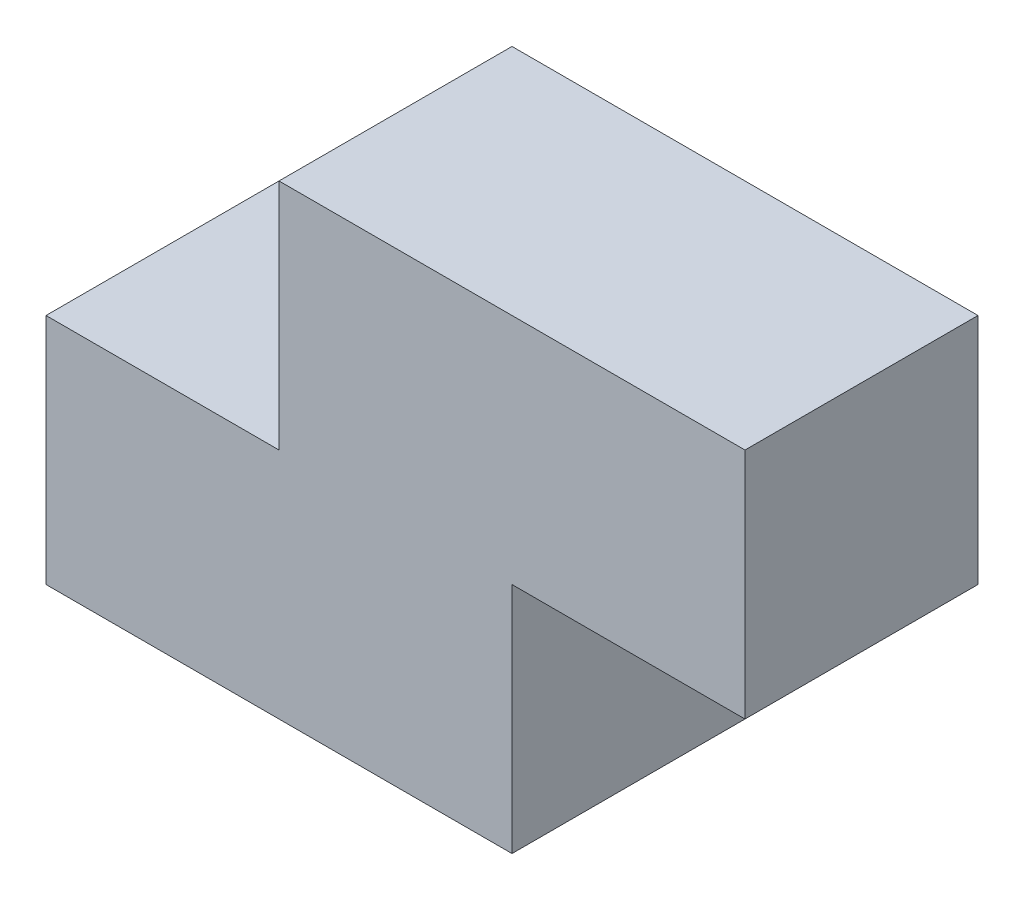
ISO-10303-21;
HEADER;
FILE_DESCRIPTION(('STEP AP214'),'2;1');
FILE_NAME('part.step','',(''),(''),'','','');
FILE_SCHEMA(('AUTOMOTIVE_DESIGN { 1 0 10303 214 1 1 1 1 }'));
ENDSEC;
DATA;
#1=APPLICATION_CONTEXT('core data for automotive mechanical design processes');
#2=APPLICATION_PROTOCOL_DEFINITION('international standard','automotive_design',2000,#1);
#3=PRODUCT_CONTEXT('',#1,'mechanical');
#4=PRODUCT('Part','Part','',(#3));
#5=PRODUCT_RELATED_PRODUCT_CATEGORY('part','',(#4));
#6=PRODUCT_DEFINITION_FORMATION('','',#4);
#7=PRODUCT_DEFINITION_CONTEXT('part definition',#1,'design');
#8=PRODUCT_DEFINITION('design','',#6,#7);
#9=PRODUCT_DEFINITION_SHAPE('','',#8);
#10=(LENGTH_UNIT() NAMED_UNIT(*) SI_UNIT(.MILLI.,.METRE.));
#11=(NAMED_UNIT(*) PLANE_ANGLE_UNIT() SI_UNIT($,.RADIAN.));
#12=(NAMED_UNIT(*) SI_UNIT($,.STERADIAN.) SOLID_ANGLE_UNIT());
#13=UNCERTAINTY_MEASURE_WITH_UNIT(LENGTH_MEASURE(1.E-05),#10,'distance_accuracy_value','');
#14=(GEOMETRIC_REPRESENTATION_CONTEXT(3) GLOBAL_UNCERTAINTY_ASSIGNED_CONTEXT((#13)) GLOBAL_UNIT_ASSIGNED_CONTEXT((#10,
#11,#12)) REPRESENTATION_CONTEXT('',''));
#15=CARTESIAN_POINT('',(0.,0.,0.));
#16=DIRECTION('',(0.,0.,1.));
#17=DIRECTION('',(1.,0.,0.));
#18=AXIS2_PLACEMENT_3D('',#15,#16,#17);
#19=CARTESIAN_POINT('',(0.,30.,-15.));
#20=DIRECTION('',(-1.,0.,0.));
#21=DIRECTION('',(0.,0.,1.));
#22=AXIS2_PLACEMENT_3D('',#19,#20,#21);
#23=PLANE('',#22);
#24=DIRECTION('',(0.,0.,1.));
#25=VECTOR('',#24,1.);
#26=CARTESIAN_POINT('',(0.,0.,-15.));
#27=LINE('',#26,#25);
#28=CARTESIAN_POINT('',(0.,0.,-15.));
#29=VERTEX_POINT('',#28);
#30=CARTESIAN_POINT('',(0.,0.,15.));
#31=VERTEX_POINT('',#30);
#32=EDGE_CURVE('E36',#29,#31,#27,.T.);
#33=ORIENTED_EDGE('',*,*,#32,.T.);
#34=DIRECTION('',(0.,-1.,0.));
#35=VECTOR('',#34,1.);
#36=CARTESIAN_POINT('',(0.,30.,15.));
#37=LINE('',#36,#35);
#38=CARTESIAN_POINT('',(0.,30.,15.));
#39=VERTEX_POINT('',#38);
#40=EDGE_CURVE('E97',#39,#31,#37,.T.);
#41=ORIENTED_EDGE('',*,*,#40,.F.);
#42=DIRECTION('',(0.,0.,1.));
#43=VECTOR('',#42,1.);
#44=CARTESIAN_POINT('',(0.,30.,-15.));
#45=LINE('',#44,#43);
#46=CARTESIAN_POINT('',(0.,30.,-15.));
#47=VERTEX_POINT('',#46);
#48=EDGE_CURVE('E11',#47,#39,#45,.T.);
#49=ORIENTED_EDGE('',*,*,#48,.F.);
#50=DIRECTION('',(0.,-1.,0.));
#51=VECTOR('',#50,1.);
#52=CARTESIAN_POINT('',(0.,30.,-15.));
#53=LINE('',#52,#51);
#54=EDGE_CURVE('E98',#47,#29,#53,.T.);
#55=ORIENTED_EDGE('',*,*,#54,.T.);
#56=EDGE_LOOP('',(#33,#41,#49,#55));
#57=FACE_BOUND('',#56,.T.);
#58=ADVANCED_FACE('F33',(#57),#23,.T.);
#59=CARTESIAN_POINT('',(30.,30.,-15.));
#60=DIRECTION('',(0.,1.,0.));
#61=DIRECTION('',(0.,0.,1.));
#62=AXIS2_PLACEMENT_3D('',#59,#60,#61);
#63=PLANE('',#62);
#64=ORIENTED_EDGE('',*,*,#48,.T.);
#65=DIRECTION('',(-1.,0.,0.));
#66=VECTOR('',#65,1.);
#67=CARTESIAN_POINT('',(30.,30.,15.));
#68=LINE('',#67,#66);
#69=CARTESIAN_POINT('',(30.,30.,15.));
#70=VERTEX_POINT('',#69);
#71=EDGE_CURVE('E115',#70,#39,#68,.T.);
#72=ORIENTED_EDGE('',*,*,#71,.F.);
#73=DIRECTION('',(0.,0.,1.));
#74=VECTOR('',#73,1.);
#75=CARTESIAN_POINT('',(30.,30.,-15.));
#76=LINE('',#75,#74);
#77=CARTESIAN_POINT('',(30.,30.,-15.));
#78=VERTEX_POINT('',#77);
#79=EDGE_CURVE('E41',#78,#70,#76,.T.);
#80=ORIENTED_EDGE('',*,*,#79,.F.);
#81=DIRECTION('',(-1.,0.,0.));
#82=VECTOR('',#81,1.);
#83=CARTESIAN_POINT('',(30.,30.,-15.));
#84=LINE('',#83,#82);
#85=EDGE_CURVE('E103',#78,#47,#84,.T.);
#86=ORIENTED_EDGE('',*,*,#85,.T.);
#87=EDGE_LOOP('',(#64,#72,#80,#86));
#88=FACE_BOUND('',#87,.T.);
#89=ADVANCED_FACE('F179',(#88),#63,.T.);
#90=CARTESIAN_POINT('',(30.,60.,-15.));
#91=DIRECTION('',(-1.,0.,0.));
#92=DIRECTION('',(0.,0.,1.));
#93=AXIS2_PLACEMENT_3D('',#90,#91,#92);
#94=PLANE('',#93);
#95=ORIENTED_EDGE('',*,*,#79,.T.);
#96=DIRECTION('',(0.,-1.,0.));
#97=VECTOR('',#96,1.);
#98=CARTESIAN_POINT('',(30.,60.,15.));
#99=LINE('',#98,#97);
#100=CARTESIAN_POINT('',(30.,60.,15.));
#101=VERTEX_POINT('',#100);
#102=EDGE_CURVE('E128',#101,#70,#99,.T.);
#103=ORIENTED_EDGE('',*,*,#102,.F.);
#104=DIRECTION('',(0.,0.,1.));
#105=VECTOR('',#104,1.);
#106=CARTESIAN_POINT('',(30.,60.,-15.));
#107=LINE('',#106,#105);
#108=CARTESIAN_POINT('',(30.,60.,-15.));
#109=VERTEX_POINT('',#108);
#110=EDGE_CURVE('E150',#109,#101,#107,.T.);
#111=ORIENTED_EDGE('',*,*,#110,.F.);
#112=DIRECTION('',(0.,-1.,0.));
#113=VECTOR('',#112,1.);
#114=CARTESIAN_POINT('',(30.,60.,-15.));
#115=LINE('',#114,#113);
#116=EDGE_CURVE('E146',#109,#78,#115,.T.);
#117=ORIENTED_EDGE('',*,*,#116,.T.);
#118=EDGE_LOOP('',(#95,#103,#111,#117));
#119=FACE_BOUND('',#118,.T.);
#120=ADVANCED_FACE('F178',(#119),#94,.T.);
#121=CARTESIAN_POINT('',(90.,60.,-15.));
#122=DIRECTION('',(0.,1.,0.));
#123=DIRECTION('',(0.,0.,1.));
#124=AXIS2_PLACEMENT_3D('',#121,#122,#123);
#125=PLANE('',#124);
#126=ORIENTED_EDGE('',*,*,#110,.T.);
#127=DIRECTION('',(-1.,0.,0.));
#128=VECTOR('',#127,1.);
#129=CARTESIAN_POINT('',(90.,60.,15.));
#130=LINE('',#129,#128);
#131=CARTESIAN_POINT('',(90.,60.,15.));
#132=VERTEX_POINT('',#131);
#133=EDGE_CURVE('E125',#132,#101,#130,.T.);
#134=ORIENTED_EDGE('',*,*,#133,.F.);
#135=DIRECTION('',(0.,0.,1.));
#136=VECTOR('',#135,1.);
#137=CARTESIAN_POINT('',(90.,60.,-15.));
#138=LINE('',#137,#136);
#139=CARTESIAN_POINT('',(90.,60.,-15.));
#140=VERTEX_POINT('',#139);
#141=EDGE_CURVE('E152',#140,#132,#138,.T.);
#142=ORIENTED_EDGE('',*,*,#141,.F.);
#143=DIRECTION('',(-1.,0.,0.));
#144=VECTOR('',#143,1.);
#145=CARTESIAN_POINT('',(90.,60.,-15.));
#146=LINE('',#145,#144);
#147=EDGE_CURVE('E143',#140,#109,#146,.T.);
#148=ORIENTED_EDGE('',*,*,#147,.T.);
#149=EDGE_LOOP('',(#126,#134,#142,#148));
#150=FACE_BOUND('',#149,.T.);
#151=ADVANCED_FACE('F174',(#150),#125,.T.);
#152=CARTESIAN_POINT('',(90.,30.,-15.));
#153=DIRECTION('',(1.,0.,0.));
#154=DIRECTION('',(0.,0.,-1.));
#155=AXIS2_PLACEMENT_3D('',#152,#153,#154);
#156=PLANE('',#155);
#157=ORIENTED_EDGE('',*,*,#141,.T.);
#158=DIRECTION('',(0.,1.,0.));
#159=VECTOR('',#158,1.);
#160=CARTESIAN_POINT('',(90.,30.,15.));
#161=LINE('',#160,#159);
#162=CARTESIAN_POINT('',(90.,30.,15.));
#163=VERTEX_POINT('',#162);
#164=EDGE_CURVE('E122',#163,#132,#161,.T.);
#165=ORIENTED_EDGE('',*,*,#164,.F.);
#166=DIRECTION('',(0.,0.,1.));
#167=VECTOR('',#166,1.);
#168=CARTESIAN_POINT('',(90.,30.,-15.));
#169=LINE('',#168,#167);
#170=CARTESIAN_POINT('',(90.,30.,-15.));
#171=VERTEX_POINT('',#170);
#172=EDGE_CURVE('E154',#171,#163,#169,.T.);
#173=ORIENTED_EDGE('',*,*,#172,.F.);
#174=DIRECTION('',(0.,1.,0.));
#175=VECTOR('',#174,1.);
#176=CARTESIAN_POINT('',(90.,30.,-15.));
#177=LINE('',#176,#175);
#178=EDGE_CURVE('E140',#171,#140,#177,.T.);
#179=ORIENTED_EDGE('',*,*,#178,.T.);
#180=EDGE_LOOP('',(#157,#165,#173,#179));
#181=FACE_BOUND('',#180,.T.);
#182=ADVANCED_FACE('F167',(#181),#156,.T.);
#183=CARTESIAN_POINT('',(60.,30.,-15.));
#184=DIRECTION('',(0.,-1.,0.));
#185=DIRECTION('',(0.,0.,-1.));
#186=AXIS2_PLACEMENT_3D('',#183,#184,#185);
#187=PLANE('',#186);
#188=ORIENTED_EDGE('',*,*,#172,.T.);
#189=DIRECTION('',(1.,0.,0.));
#190=VECTOR('',#189,1.);
#191=CARTESIAN_POINT('',(60.,30.,15.));
#192=LINE('',#191,#190);
#193=CARTESIAN_POINT('',(60.,30.,15.));
#194=VERTEX_POINT('',#193);
#195=EDGE_CURVE('E119',#194,#163,#192,.T.);
#196=ORIENTED_EDGE('',*,*,#195,.F.);
#197=DIRECTION('',(0.,0.,1.));
#198=VECTOR('',#197,1.);
#199=CARTESIAN_POINT('',(60.,30.,-15.));
#200=LINE('',#199,#198);
#201=CARTESIAN_POINT('',(60.,30.,-15.));
#202=VERTEX_POINT('',#201);
#203=EDGE_CURVE('E156',#202,#194,#200,.T.);
#204=ORIENTED_EDGE('',*,*,#203,.F.);
#205=DIRECTION('',(1.,0.,0.));
#206=VECTOR('',#205,1.);
#207=CARTESIAN_POINT('',(60.,30.,-15.));
#208=LINE('',#207,#206);
#209=EDGE_CURVE('E137',#202,#171,#208,.T.);
#210=ORIENTED_EDGE('',*,*,#209,.T.);
#211=EDGE_LOOP('',(#188,#196,#204,#210));
#212=FACE_BOUND('',#211,.T.);
#213=ADVANCED_FACE('F164',(#212),#187,.T.);
#214=CARTESIAN_POINT('',(60.,0.,-15.));
#215=DIRECTION('',(1.,0.,0.));
#216=DIRECTION('',(0.,0.,-1.));
#217=AXIS2_PLACEMENT_3D('',#214,#215,#216);
#218=PLANE('',#217);
#219=ORIENTED_EDGE('',*,*,#203,.T.);
#220=DIRECTION('',(0.,1.,0.));
#221=VECTOR('',#220,1.);
#222=CARTESIAN_POINT('',(60.,0.,15.));
#223=LINE('',#222,#221);
#224=CARTESIAN_POINT('',(60.,0.,15.));
#225=VERTEX_POINT('',#224);
#226=EDGE_CURVE('E110',#225,#194,#223,.T.);
#227=ORIENTED_EDGE('',*,*,#226,.F.);
#228=DIRECTION('',(0.,0.,1.));
#229=VECTOR('',#228,1.);
#230=CARTESIAN_POINT('',(60.,0.,-15.));
#231=LINE('',#230,#229);
#232=CARTESIAN_POINT('',(60.,0.,-15.));
#233=VERTEX_POINT('',#232);
#234=EDGE_CURVE('E102',#233,#225,#231,.T.);
#235=ORIENTED_EDGE('',*,*,#234,.F.);
#236=DIRECTION('',(0.,1.,0.));
#237=VECTOR('',#236,1.);
#238=CARTESIAN_POINT('',(60.,0.,-15.));
#239=LINE('',#238,#237);
#240=EDGE_CURVE('E134',#233,#202,#239,.T.);
#241=ORIENTED_EDGE('',*,*,#240,.T.);
#242=EDGE_LOOP('',(#219,#227,#235,#241));
#243=FACE_BOUND('',#242,.T.);
#244=ADVANCED_FACE('F158',(#243),#218,.T.);
#245=CARTESIAN_POINT('',(0.,0.,-15.));
#246=DIRECTION('',(0.,-1.,0.));
#247=DIRECTION('',(0.,0.,-1.));
#248=AXIS2_PLACEMENT_3D('',#245,#246,#247);
#249=PLANE('',#248);
#250=ORIENTED_EDGE('',*,*,#234,.T.);
#251=DIRECTION('',(1.,0.,0.));
#252=VECTOR('',#251,1.);
#253=CARTESIAN_POINT('',(0.,0.,15.));
#254=LINE('',#253,#252);
#255=EDGE_CURVE('E105',#31,#225,#254,.T.);
#256=ORIENTED_EDGE('',*,*,#255,.F.);
#257=ORIENTED_EDGE('',*,*,#32,.F.);
#258=DIRECTION('',(1.,0.,0.));
#259=VECTOR('',#258,1.);
#260=CARTESIAN_POINT('',(0.,0.,-15.));
#261=LINE('',#260,#259);
#262=EDGE_CURVE('E132',#29,#233,#261,.T.);
#263=ORIENTED_EDGE('',*,*,#262,.T.);
#264=EDGE_LOOP('',(#250,#256,#257,#263));
#265=FACE_BOUND('',#264,.T.);
#266=ADVANCED_FACE('F106',(#265),#249,.T.);
#267=CARTESIAN_POINT('',(0.,0.,-15.));
#268=DIRECTION('',(0.,0.,1.));
#269=DIRECTION('',(1.,0.,0.));
#270=AXIS2_PLACEMENT_3D('',#267,#268,#269);
#271=PLANE('',#270);
#272=ORIENTED_EDGE('',*,*,#54,.F.);
#273=ORIENTED_EDGE('',*,*,#85,.F.);
#274=ORIENTED_EDGE('',*,*,#116,.F.);
#275=ORIENTED_EDGE('',*,*,#147,.F.);
#276=ORIENTED_EDGE('',*,*,#178,.F.);
#277=ORIENTED_EDGE('',*,*,#209,.F.);
#278=ORIENTED_EDGE('',*,*,#240,.F.);
#279=ORIENTED_EDGE('',*,*,#262,.F.);
#280=EDGE_LOOP('',(#272,#273,#274,#275,#276,#277,#278,#279));
#281=FACE_BOUND('',#280,.T.);
#282=ADVANCED_FACE('F170',(#281),#271,.F.);
#283=CARTESIAN_POINT('',(0.,0.,15.));
#284=DIRECTION('',(0.,0.,1.));
#285=DIRECTION('',(1.,0.,0.));
#286=AXIS2_PLACEMENT_3D('',#283,#284,#285);
#287=PLANE('',#286);
#288=ORIENTED_EDGE('',*,*,#40,.T.);
#289=ORIENTED_EDGE('',*,*,#255,.T.);
#290=ORIENTED_EDGE('',*,*,#226,.T.);
#291=ORIENTED_EDGE('',*,*,#195,.T.);
#292=ORIENTED_EDGE('',*,*,#164,.T.);
#293=ORIENTED_EDGE('',*,*,#133,.T.);
#294=ORIENTED_EDGE('',*,*,#102,.T.);
#295=ORIENTED_EDGE('',*,*,#71,.T.);
#296=EDGE_LOOP('',(#288,#289,#290,#291,#292,#293,#294,#295));
#297=FACE_BOUND('',#296,.T.);
#298=ADVANCED_FACE('F113',(#297),#287,.T.);
#299=CLOSED_SHELL('',(#58,#89,#120,#151,#182,#213,#244,#266,#282,#298));
#300=MANIFOLD_SOLID_BREP('B2',#299);
#301=ADVANCED_BREP_SHAPE_REPRESENTATION('',(#18,#300),#14);
#302=SHAPE_DEFINITION_REPRESENTATION(#9,#301);
ENDSEC;
END-ISO-10303-21;
